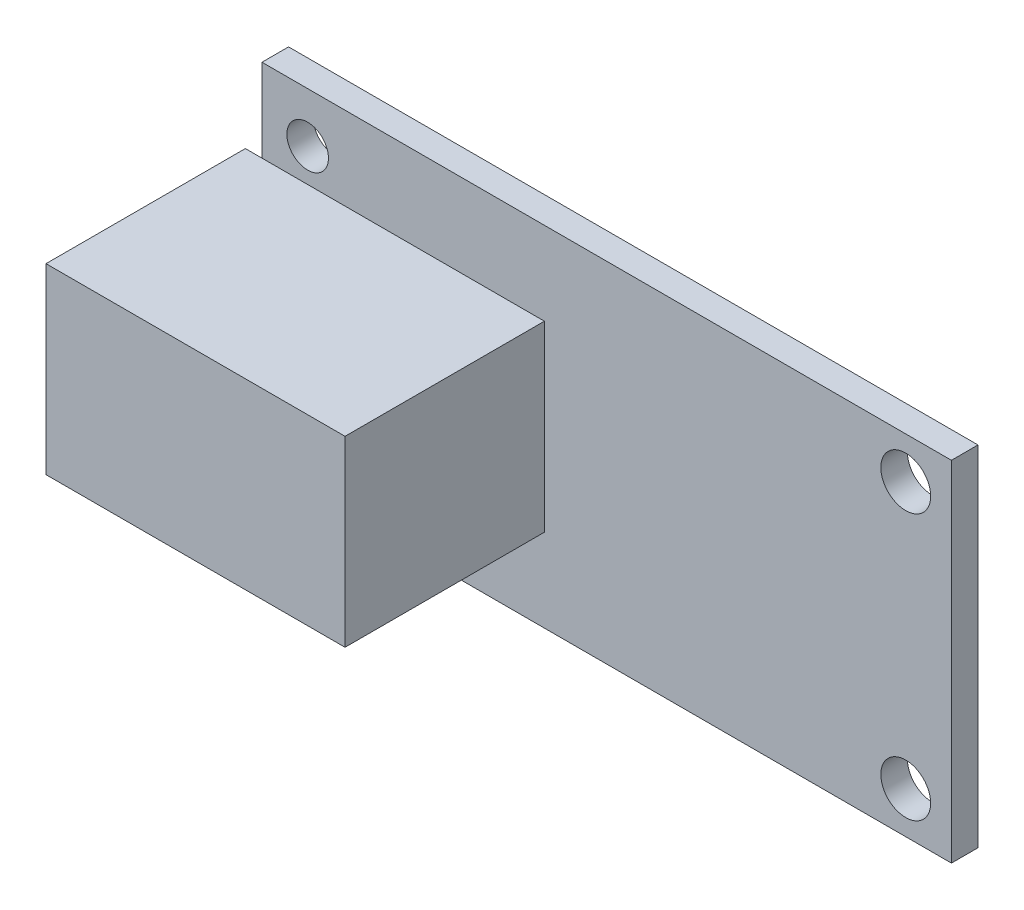
ISO-10303-21;
HEADER;
FILE_DESCRIPTION(('STEP AP214'),'2;1');
FILE_NAME('part.step','',(''),(''),'','','');
FILE_SCHEMA(('AUTOMOTIVE_DESIGN { 1 0 10303 214 1 1 1 1 }'));
ENDSEC;
DATA;
#1=APPLICATION_CONTEXT('core data for automotive mechanical design processes');
#2=APPLICATION_PROTOCOL_DEFINITION('international standard','automotive_design',2000,#1);
#3=PRODUCT_CONTEXT('',#1,'mechanical');
#4=PRODUCT('Part','Part','',(#3));
#5=PRODUCT_RELATED_PRODUCT_CATEGORY('part','',(#4));
#6=PRODUCT_DEFINITION_FORMATION('','',#4);
#7=PRODUCT_DEFINITION_CONTEXT('part definition',#1,'design');
#8=PRODUCT_DEFINITION('design','',#6,#7);
#9=PRODUCT_DEFINITION_SHAPE('','',#8);
#10=(LENGTH_UNIT() NAMED_UNIT(*) SI_UNIT(.MILLI.,.METRE.));
#11=(NAMED_UNIT(*) PLANE_ANGLE_UNIT() SI_UNIT($,.RADIAN.));
#12=(NAMED_UNIT(*) SI_UNIT($,.STERADIAN.) SOLID_ANGLE_UNIT());
#13=UNCERTAINTY_MEASURE_WITH_UNIT(LENGTH_MEASURE(1.E-05),#10,'distance_accuracy_value','');
#14=(GEOMETRIC_REPRESENTATION_CONTEXT(3) GLOBAL_UNCERTAINTY_ASSIGNED_CONTEXT((#13)) GLOBAL_UNIT_ASSIGNED_CONTEXT((#10,
#11,#12)) REPRESENTATION_CONTEXT('',''));
#15=CARTESIAN_POINT('',(0.,0.,0.));
#16=DIRECTION('',(0.,0.,1.));
#17=DIRECTION('',(1.,0.,0.));
#18=AXIS2_PLACEMENT_3D('',#15,#16,#17);
#19=CARTESIAN_POINT('',(-20.75,10.5,1.6));
#20=DIRECTION('',(1.,0.,0.));
#21=DIRECTION('',(0.,0.,-1.));
#22=AXIS2_PLACEMENT_3D('',#19,#20,#21);
#23=PLANE('',#22);
#24=DIRECTION('',(0.,-1.,0.));
#25=VECTOR('',#24,1.);
#26=CARTESIAN_POINT('',(-20.75,10.5,0.));
#27=LINE('',#26,#25);
#28=CARTESIAN_POINT('',(-20.75,10.5,0.));
#29=VERTEX_POINT('',#28);
#30=CARTESIAN_POINT('',(-20.75,-10.5,0.));
#31=VERTEX_POINT('',#30);
#32=EDGE_CURVE('E129',#29,#31,#27,.T.);
#33=ORIENTED_EDGE('',*,*,#32,.T.);
#34=DIRECTION('',(0.,0.,-1.));
#35=VECTOR('',#34,1.);
#36=CARTESIAN_POINT('',(-20.75,-10.5,1.6));
#37=LINE('',#36,#35);
#38=CARTESIAN_POINT('',(-20.75,-10.5,1.6));
#39=VERTEX_POINT('',#38);
#40=EDGE_CURVE('E37',#39,#31,#37,.T.);
#41=ORIENTED_EDGE('',*,*,#40,.F.);
#42=DIRECTION('',(0.,-1.,0.));
#43=VECTOR('',#42,1.);
#44=CARTESIAN_POINT('',(-20.75,10.5,1.6));
#45=LINE('',#44,#43);
#46=CARTESIAN_POINT('',(-20.75,-5.49999999999999,1.6));
#47=VERTEX_POINT('',#46);
#48=EDGE_CURVE('E142',#47,#39,#45,.T.);
#49=ORIENTED_EDGE('',*,*,#48,.F.);
#50=CARTESIAN_POINT('',(-20.75,5.5,1.6));
#51=VERTEX_POINT('',#50);
#52=EDGE_CURVE('E141',#51,#47,#45,.T.);
#53=ORIENTED_EDGE('',*,*,#52,.F.);
#54=CARTESIAN_POINT('',(-20.75,10.5,1.6));
#55=VERTEX_POINT('',#54);
#56=EDGE_CURVE('E138',#55,#51,#45,.T.);
#57=ORIENTED_EDGE('',*,*,#56,.F.);
#58=DIRECTION('',(0.,0.,-1.));
#59=VECTOR('',#58,1.);
#60=CARTESIAN_POINT('',(-20.75,10.5,1.6));
#61=LINE('',#60,#59);
#62=EDGE_CURVE('E147',#55,#29,#61,.T.);
#63=ORIENTED_EDGE('',*,*,#62,.T.);
#64=EDGE_LOOP('',(#33,#41,#49,#53,#57,#63));
#65=FACE_BOUND('',#64,.T.);
#66=ADVANCED_FACE('F34',(#65),#23,.F.);
#67=CARTESIAN_POINT('',(-20.75,-10.5,1.6));
#68=DIRECTION('',(0.,1.,0.));
#69=DIRECTION('',(0.,0.,1.));
#70=AXIS2_PLACEMENT_3D('',#67,#68,#69);
#71=PLANE('',#70);
#72=DIRECTION('',(1.,0.,0.));
#73=VECTOR('',#72,1.);
#74=CARTESIAN_POINT('',(-20.75,-10.5,0.));
#75=LINE('',#74,#73);
#76=CARTESIAN_POINT('',(20.75,-10.5,0.));
#77=VERTEX_POINT('',#76);
#78=EDGE_CURVE('E132',#31,#77,#75,.T.);
#79=ORIENTED_EDGE('',*,*,#78,.T.);
#80=DIRECTION('',(0.,0.,-1.));
#81=VECTOR('',#80,1.);
#82=CARTESIAN_POINT('',(20.75,-10.5,1.6));
#83=LINE('',#82,#81);
#84=CARTESIAN_POINT('',(20.75,-10.5,1.6));
#85=VERTEX_POINT('',#84);
#86=EDGE_CURVE('E158',#85,#77,#83,.T.);
#87=ORIENTED_EDGE('',*,*,#86,.F.);
#88=DIRECTION('',(1.,0.,0.));
#89=VECTOR('',#88,1.);
#90=CARTESIAN_POINT('',(-20.75,-10.5,1.6));
#91=LINE('',#90,#89);
#92=EDGE_CURVE('E140',#39,#85,#91,.T.);
#93=ORIENTED_EDGE('',*,*,#92,.F.);
#94=ORIENTED_EDGE('',*,*,#40,.T.);
#95=EDGE_LOOP('',(#79,#87,#93,#94));
#96=FACE_BOUND('',#95,.T.);
#97=ADVANCED_FACE('F168',(#96),#71,.F.);
#98=CARTESIAN_POINT('',(20.75,10.5,1.6));
#99=DIRECTION('',(-1.,0.,0.));
#100=DIRECTION('',(0.,0.,1.));
#101=AXIS2_PLACEMENT_3D('',#98,#99,#100);
#102=PLANE('',#101);
#103=DIRECTION('',(0.,1.,0.));
#104=VECTOR('',#103,1.);
#105=CARTESIAN_POINT('',(20.75,10.5,0.));
#106=LINE('',#105,#104);
#107=CARTESIAN_POINT('',(20.75,10.5,0.));
#108=VERTEX_POINT('',#107);
#109=EDGE_CURVE('E150',#77,#108,#106,.T.);
#110=ORIENTED_EDGE('',*,*,#109,.T.);
#111=DIRECTION('',(0.,0.,-1.));
#112=VECTOR('',#111,1.);
#113=CARTESIAN_POINT('',(20.75,10.5,1.6));
#114=LINE('',#113,#112);
#115=CARTESIAN_POINT('',(20.75,10.5,1.6));
#116=VERTEX_POINT('',#115);
#117=EDGE_CURVE('E156',#116,#108,#114,.T.);
#118=ORIENTED_EDGE('',*,*,#117,.F.);
#119=DIRECTION('',(0.,1.,0.));
#120=VECTOR('',#119,1.);
#121=CARTESIAN_POINT('',(20.75,10.5,1.6));
#122=LINE('',#121,#120);
#123=EDGE_CURVE('E144',#85,#116,#122,.T.);
#124=ORIENTED_EDGE('',*,*,#123,.F.);
#125=ORIENTED_EDGE('',*,*,#86,.T.);
#126=EDGE_LOOP('',(#110,#118,#124,#125));
#127=FACE_BOUND('',#126,.T.);
#128=ADVANCED_FACE('F177',(#127),#102,.F.);
#129=CARTESIAN_POINT('',(-20.75,10.5,1.6));
#130=DIRECTION('',(0.,-1.,0.));
#131=DIRECTION('',(0.,0.,-1.));
#132=AXIS2_PLACEMENT_3D('',#129,#130,#131);
#133=PLANE('',#132);
#134=DIRECTION('',(-1.,0.,0.));
#135=VECTOR('',#134,1.);
#136=CARTESIAN_POINT('',(-20.75,10.5,0.));
#137=LINE('',#136,#135);
#138=EDGE_CURVE('E152',#108,#29,#137,.T.);
#139=ORIENTED_EDGE('',*,*,#138,.T.);
#140=ORIENTED_EDGE('',*,*,#62,.F.);
#141=DIRECTION('',(-1.,0.,0.));
#142=VECTOR('',#141,1.);
#143=CARTESIAN_POINT('',(-20.75,10.5,1.6));
#144=LINE('',#143,#142);
#145=EDGE_CURVE('E146',#116,#55,#144,.T.);
#146=ORIENTED_EDGE('',*,*,#145,.F.);
#147=ORIENTED_EDGE('',*,*,#117,.T.);
#148=EDGE_LOOP('',(#139,#140,#146,#147));
#149=FACE_BOUND('',#148,.T.);
#150=ADVANCED_FACE('F180',(#149),#133,.F.);
#151=CARTESIAN_POINT('',(0.,0.,1.6));
#152=DIRECTION('',(0.,0.,1.));
#153=DIRECTION('',(1.,0.,0.));
#154=AXIS2_PLACEMENT_3D('',#151,#152,#153);
#155=PLANE('',#154);
#156=CARTESIAN_POINT('',(-18.,-7.5,1.6));
#157=DIRECTION('',(0.,0.,1.));
#158=DIRECTION('',(-1.,0.,0.));
#159=AXIS2_PLACEMENT_3D('',#156,#157,#158);
#160=CIRCLE('',#159,1.25);
#161=CARTESIAN_POINT('',(-19.25,-7.5,1.6));
#162=VERTEX_POINT('',#161);
#163=EDGE_CURVE('E209',#162,#162,#160,.T.);
#164=ORIENTED_EDGE('',*,*,#163,.F.);
#165=EDGE_LOOP('',(#164));
#166=FACE_BOUND('',#165,.T.);
#167=CARTESIAN_POINT('',(18.,-7.99999999999999,1.6));
#168=DIRECTION('',(0.,0.,1.));
#169=DIRECTION('',(-1.,0.,0.));
#170=AXIS2_PLACEMENT_3D('',#167,#168,#169);
#171=CIRCLE('',#170,1.5);
#172=CARTESIAN_POINT('',(16.5,-7.99999999999999,1.6));
#173=VERTEX_POINT('',#172);
#174=EDGE_CURVE('E215',#173,#173,#171,.T.);
#175=ORIENTED_EDGE('',*,*,#174,.F.);
#176=EDGE_LOOP('',(#175));
#177=FACE_BOUND('',#176,.T.);
#178=CARTESIAN_POINT('',(18.,8.00000000000001,1.6));
#179=DIRECTION('',(0.,0.,1.));
#180=DIRECTION('',(1.,0.,0.));
#181=AXIS2_PLACEMENT_3D('',#178,#179,#180);
#182=CIRCLE('',#181,1.5);
#183=CARTESIAN_POINT('',(19.5,8.00000000000001,1.6));
#184=VERTEX_POINT('',#183);
#185=EDGE_CURVE('E221',#184,#184,#182,.T.);
#186=ORIENTED_EDGE('',*,*,#185,.F.);
#187=EDGE_LOOP('',(#186));
#188=FACE_BOUND('',#187,.T.);
#189=CARTESIAN_POINT('',(-18.,7.5,1.6));
#190=DIRECTION('',(0.,0.,1.));
#191=DIRECTION('',(1.,0.,0.));
#192=AXIS2_PLACEMENT_3D('',#189,#190,#191);
#193=CIRCLE('',#192,1.25);
#194=CARTESIAN_POINT('',(-16.75,7.5,1.6));
#195=VERTEX_POINT('',#194);
#196=EDGE_CURVE('E203',#195,#195,#193,.T.);
#197=ORIENTED_EDGE('',*,*,#196,.F.);
#198=EDGE_LOOP('',(#197));
#199=FACE_BOUND('',#198,.T.);
#200=DIRECTION('',(-1.,0.,0.));
#201=VECTOR('',#200,1.);
#202=CARTESIAN_POINT('',(-21.75,5.5,1.6));
#203=LINE('',#202,#201);
#204=CARTESIAN_POINT('',(-3.75,5.5,1.6));
#205=VERTEX_POINT('',#204);
#206=EDGE_CURVE('E50',#205,#51,#203,.T.);
#207=ORIENTED_EDGE('',*,*,#206,.F.);
#208=DIRECTION('',(0.,1.,0.));
#209=VECTOR('',#208,1.);
#210=CARTESIAN_POINT('',(-3.75,5.5,1.6));
#211=LINE('',#210,#209);
#212=CARTESIAN_POINT('',(-3.75,-5.5,1.6));
#213=VERTEX_POINT('',#212);
#214=EDGE_CURVE('E187',#213,#205,#211,.T.);
#215=ORIENTED_EDGE('',*,*,#214,.F.);
#216=DIRECTION('',(1.,0.,0.));
#217=VECTOR('',#216,1.);
#218=CARTESIAN_POINT('',(-21.75,-5.5,1.6));
#219=LINE('',#218,#217);
#220=EDGE_CURVE('E11',#47,#213,#219,.T.);
#221=ORIENTED_EDGE('',*,*,#220,.F.);
#222=ORIENTED_EDGE('',*,*,#48,.T.);
#223=ORIENTED_EDGE('',*,*,#92,.T.);
#224=ORIENTED_EDGE('',*,*,#123,.T.);
#225=ORIENTED_EDGE('',*,*,#145,.T.);
#226=ORIENTED_EDGE('',*,*,#56,.T.);
#227=EDGE_LOOP('',(#207,#215,#221,#222,#223,#224,#225,#226));
#228=FACE_BOUND('',#227,.T.);
#229=ADVANCED_FACE('F181',(#166,#177,#188,#199,#228),#155,.T.);
#230=CARTESIAN_POINT('',(0.,0.,0.));
#231=DIRECTION('',(0.,0.,1.));
#232=DIRECTION('',(1.,0.,0.));
#233=AXIS2_PLACEMENT_3D('',#230,#231,#232);
#234=PLANE('',#233);
#235=CARTESIAN_POINT('',(-18.,-7.5,0.));
#236=DIRECTION('',(0.,0.,1.));
#237=DIRECTION('',(-1.,0.,0.));
#238=AXIS2_PLACEMENT_3D('',#235,#236,#237);
#239=CIRCLE('',#238,1.25);
#240=CARTESIAN_POINT('',(-19.25,-7.5,0.));
#241=VERTEX_POINT('',#240);
#242=EDGE_CURVE('E212',#241,#241,#239,.T.);
#243=ORIENTED_EDGE('',*,*,#242,.T.);
#244=EDGE_LOOP('',(#243));
#245=FACE_BOUND('',#244,.T.);
#246=CARTESIAN_POINT('',(18.,-7.99999999999999,0.));
#247=DIRECTION('',(0.,0.,1.));
#248=DIRECTION('',(-1.,0.,0.));
#249=AXIS2_PLACEMENT_3D('',#246,#247,#248);
#250=CIRCLE('',#249,1.5);
#251=CARTESIAN_POINT('',(16.5,-7.99999999999999,0.));
#252=VERTEX_POINT('',#251);
#253=EDGE_CURVE('E218',#252,#252,#250,.T.);
#254=ORIENTED_EDGE('',*,*,#253,.T.);
#255=EDGE_LOOP('',(#254));
#256=FACE_BOUND('',#255,.T.);
#257=CARTESIAN_POINT('',(18.,8.00000000000001,0.));
#258=DIRECTION('',(0.,0.,1.));
#259=DIRECTION('',(1.,0.,0.));
#260=AXIS2_PLACEMENT_3D('',#257,#258,#259);
#261=CIRCLE('',#260,1.5);
#262=CARTESIAN_POINT('',(19.5,8.00000000000001,0.));
#263=VERTEX_POINT('',#262);
#264=EDGE_CURVE('E206',#263,#263,#261,.T.);
#265=ORIENTED_EDGE('',*,*,#264,.T.);
#266=EDGE_LOOP('',(#265));
#267=FACE_BOUND('',#266,.T.);
#268=CARTESIAN_POINT('',(-18.,7.5,0.));
#269=DIRECTION('',(0.,0.,1.));
#270=DIRECTION('',(1.,0.,0.));
#271=AXIS2_PLACEMENT_3D('',#268,#269,#270);
#272=CIRCLE('',#271,1.25);
#273=CARTESIAN_POINT('',(-16.75,7.5,0.));
#274=VERTEX_POINT('',#273);
#275=EDGE_CURVE('E189',#274,#274,#272,.T.);
#276=ORIENTED_EDGE('',*,*,#275,.T.);
#277=EDGE_LOOP('',(#276));
#278=FACE_BOUND('',#277,.T.);
#279=ORIENTED_EDGE('',*,*,#32,.F.);
#280=ORIENTED_EDGE('',*,*,#138,.F.);
#281=ORIENTED_EDGE('',*,*,#109,.F.);
#282=ORIENTED_EDGE('',*,*,#78,.F.);
#283=EDGE_LOOP('',(#279,#280,#281,#282));
#284=FACE_BOUND('',#283,.T.);
#285=ADVANCED_FACE('F175',(#245,#256,#267,#278,#284),#234,.F.);
#286=CARTESIAN_POINT('',(0.,0.,1.6));
#287=DIRECTION('',(0.,0.,1.));
#288=DIRECTION('',(1.,0.,0.));
#289=AXIS2_PLACEMENT_3D('',#286,#287,#288);
#290=PLANE('',#289);
#291=CARTESIAN_POINT('',(-21.75,5.5,1.6));
#292=VERTEX_POINT('',#291);
#293=EDGE_CURVE('E186',#51,#292,#203,.T.);
#294=ORIENTED_EDGE('',*,*,#293,.F.);
#295=ORIENTED_EDGE('',*,*,#52,.T.);
#296=CARTESIAN_POINT('',(-21.75,-5.5,1.6));
#297=VERTEX_POINT('',#296);
#298=EDGE_CURVE('E43',#297,#47,#219,.T.);
#299=ORIENTED_EDGE('',*,*,#298,.F.);
#300=DIRECTION('',(0.,-1.,0.));
#301=VECTOR('',#300,1.);
#302=CARTESIAN_POINT('',(-21.75,5.5,1.6));
#303=LINE('',#302,#301);
#304=EDGE_CURVE('E128',#292,#297,#303,.T.);
#305=ORIENTED_EDGE('',*,*,#304,.F.);
#306=EDGE_LOOP('',(#294,#295,#299,#305));
#307=FACE_BOUND('',#306,.T.);
#308=ADVANCED_FACE('F185',(#307),#290,.F.);
#309=CARTESIAN_POINT('',(-21.75,5.5,13.6));
#310=DIRECTION('',(1.,0.,0.));
#311=DIRECTION('',(0.,0.,-1.));
#312=AXIS2_PLACEMENT_3D('',#309,#310,#311);
#313=PLANE('',#312);
#314=ORIENTED_EDGE('',*,*,#304,.T.);
#315=DIRECTION('',(0.,0.,-1.));
#316=VECTOR('',#315,1.);
#317=CARTESIAN_POINT('',(-21.75,-5.5,13.6));
#318=LINE('',#317,#316);
#319=CARTESIAN_POINT('',(-21.75,-5.5,13.6));
#320=VERTEX_POINT('',#319);
#321=EDGE_CURVE('E109',#320,#297,#318,.T.);
#322=ORIENTED_EDGE('',*,*,#321,.F.);
#323=DIRECTION('',(0.,-1.,0.));
#324=VECTOR('',#323,1.);
#325=CARTESIAN_POINT('',(-21.75,5.5,13.6));
#326=LINE('',#325,#324);
#327=CARTESIAN_POINT('',(-21.75,5.5,13.6));
#328=VERTEX_POINT('',#327);
#329=EDGE_CURVE('E116',#328,#320,#326,.T.);
#330=ORIENTED_EDGE('',*,*,#329,.F.);
#331=DIRECTION('',(0.,0.,-1.));
#332=VECTOR('',#331,1.);
#333=CARTESIAN_POINT('',(-21.75,5.5,13.6));
#334=LINE('',#333,#332);
#335=EDGE_CURVE('E194',#328,#292,#334,.T.);
#336=ORIENTED_EDGE('',*,*,#335,.T.);
#337=EDGE_LOOP('',(#314,#322,#330,#336));
#338=FACE_BOUND('',#337,.T.);
#339=ADVANCED_FACE('F126',(#338),#313,.F.);
#340=CARTESIAN_POINT('',(-21.75,-5.5,13.6));
#341=DIRECTION('',(0.,1.,0.));
#342=DIRECTION('',(0.,0.,1.));
#343=AXIS2_PLACEMENT_3D('',#340,#341,#342);
#344=PLANE('',#343);
#345=ORIENTED_EDGE('',*,*,#298,.T.);
#346=ORIENTED_EDGE('',*,*,#220,.T.);
#347=DIRECTION('',(0.,0.,-1.));
#348=VECTOR('',#347,1.);
#349=CARTESIAN_POINT('',(-3.75,-5.5,13.6));
#350=LINE('',#349,#348);
#351=CARTESIAN_POINT('',(-3.75,-5.5,13.6));
#352=VERTEX_POINT('',#351);
#353=EDGE_CURVE('E112',#352,#213,#350,.T.);
#354=ORIENTED_EDGE('',*,*,#353,.F.);
#355=DIRECTION('',(1.,0.,0.));
#356=VECTOR('',#355,1.);
#357=CARTESIAN_POINT('',(-21.75,-5.5,13.6));
#358=LINE('',#357,#356);
#359=EDGE_CURVE('E104',#320,#352,#358,.T.);
#360=ORIENTED_EDGE('',*,*,#359,.F.);
#361=ORIENTED_EDGE('',*,*,#321,.T.);
#362=EDGE_LOOP('',(#345,#346,#354,#360,#361));
#363=FACE_BOUND('',#362,.T.);
#364=ADVANCED_FACE('F107',(#363),#344,.F.);
#365=CARTESIAN_POINT('',(-3.75,5.5,13.6));
#366=DIRECTION('',(-1.,0.,0.));
#367=DIRECTION('',(0.,0.,1.));
#368=AXIS2_PLACEMENT_3D('',#365,#366,#367);
#369=PLANE('',#368);
#370=ORIENTED_EDGE('',*,*,#214,.T.);
#371=DIRECTION('',(0.,0.,-1.));
#372=VECTOR('',#371,1.);
#373=CARTESIAN_POINT('',(-3.75,5.5,13.6));
#374=LINE('',#373,#372);
#375=CARTESIAN_POINT('',(-3.75,5.5,13.6));
#376=VERTEX_POINT('',#375);
#377=EDGE_CURVE('E134',#376,#205,#374,.T.);
#378=ORIENTED_EDGE('',*,*,#377,.F.);
#379=DIRECTION('',(0.,1.,0.));
#380=VECTOR('',#379,1.);
#381=CARTESIAN_POINT('',(-3.75,5.5,13.6));
#382=LINE('',#381,#380);
#383=EDGE_CURVE('E115',#352,#376,#382,.T.);
#384=ORIENTED_EDGE('',*,*,#383,.F.);
#385=ORIENTED_EDGE('',*,*,#353,.T.);
#386=EDGE_LOOP('',(#370,#378,#384,#385));
#387=FACE_BOUND('',#386,.T.);
#388=ADVANCED_FACE('F200',(#387),#369,.F.);
#389=CARTESIAN_POINT('',(-21.75,5.5,13.6));
#390=DIRECTION('',(0.,-1.,0.));
#391=DIRECTION('',(0.,0.,-1.));
#392=AXIS2_PLACEMENT_3D('',#389,#390,#391);
#393=PLANE('',#392);
#394=ORIENTED_EDGE('',*,*,#206,.T.);
#395=ORIENTED_EDGE('',*,*,#293,.T.);
#396=ORIENTED_EDGE('',*,*,#335,.F.);
#397=DIRECTION('',(-1.,0.,0.));
#398=VECTOR('',#397,1.);
#399=CARTESIAN_POINT('',(-21.75,5.5,13.6));
#400=LINE('',#399,#398);
#401=EDGE_CURVE('E121',#376,#328,#400,.T.);
#402=ORIENTED_EDGE('',*,*,#401,.F.);
#403=ORIENTED_EDGE('',*,*,#377,.T.);
#404=EDGE_LOOP('',(#394,#395,#396,#402,#403));
#405=FACE_BOUND('',#404,.T.);
#406=ADVANCED_FACE('F198',(#405),#393,.F.);
#407=CARTESIAN_POINT('',(0.,0.,13.6));
#408=DIRECTION('',(0.,0.,1.));
#409=DIRECTION('',(1.,0.,0.));
#410=AXIS2_PLACEMENT_3D('',#407,#408,#409);
#411=PLANE('',#410);
#412=ORIENTED_EDGE('',*,*,#329,.T.);
#413=ORIENTED_EDGE('',*,*,#359,.T.);
#414=ORIENTED_EDGE('',*,*,#383,.T.);
#415=ORIENTED_EDGE('',*,*,#401,.T.);
#416=EDGE_LOOP('',(#412,#413,#414,#415));
#417=FACE_BOUND('',#416,.T.);
#418=ADVANCED_FACE('F119',(#417),#411,.T.);
#419=CARTESIAN_POINT('',(-18.,7.5,0.));
#420=DIRECTION('',(0.,0.,1.));
#421=DIRECTION('',(1.,0.,0.));
#422=AXIS2_PLACEMENT_3D('',#419,#420,#421);
#423=CYLINDRICAL_SURFACE('',#422,1.25);
#424=ORIENTED_EDGE('',*,*,#275,.F.);
#425=EDGE_LOOP('',(#424));
#426=FACE_BOUND('',#425,.T.);
#427=ORIENTED_EDGE('',*,*,#196,.T.);
#428=EDGE_LOOP('',(#427));
#429=FACE_BOUND('',#428,.T.);
#430=ADVANCED_FACE('F233',(#426,#429),#423,.F.);
#431=CARTESIAN_POINT('',(18.,8.00000000000001,0.));
#432=DIRECTION('',(0.,0.,1.));
#433=DIRECTION('',(1.,0.,0.));
#434=AXIS2_PLACEMENT_3D('',#431,#432,#433);
#435=CYLINDRICAL_SURFACE('',#434,1.5);
#436=ORIENTED_EDGE('',*,*,#264,.F.);
#437=EDGE_LOOP('',(#436));
#438=FACE_BOUND('',#437,.T.);
#439=ORIENTED_EDGE('',*,*,#185,.T.);
#440=EDGE_LOOP('',(#439));
#441=FACE_BOUND('',#440,.T.);
#442=ADVANCED_FACE('F229',(#438,#441),#435,.F.);
#443=CARTESIAN_POINT('',(18.,-7.99999999999999,0.));
#444=DIRECTION('',(0.,0.,1.));
#445=DIRECTION('',(1.,0.,0.));
#446=AXIS2_PLACEMENT_3D('',#443,#444,#445);
#447=CYLINDRICAL_SURFACE('',#446,1.5);
#448=ORIENTED_EDGE('',*,*,#253,.F.);
#449=EDGE_LOOP('',(#448));
#450=FACE_BOUND('',#449,.T.);
#451=ORIENTED_EDGE('',*,*,#174,.T.);
#452=EDGE_LOOP('',(#451));
#453=FACE_BOUND('',#452,.T.);
#454=ADVANCED_FACE('F232',(#450,#453),#447,.F.);
#455=CARTESIAN_POINT('',(-18.,-7.5,0.));
#456=DIRECTION('',(0.,0.,1.));
#457=DIRECTION('',(1.,0.,0.));
#458=AXIS2_PLACEMENT_3D('',#455,#456,#457);
#459=CYLINDRICAL_SURFACE('',#458,1.25);
#460=ORIENTED_EDGE('',*,*,#242,.F.);
#461=EDGE_LOOP('',(#460));
#462=FACE_BOUND('',#461,.T.);
#463=ORIENTED_EDGE('',*,*,#163,.T.);
#464=EDGE_LOOP('',(#463));
#465=FACE_BOUND('',#464,.T.);
#466=ADVANCED_FACE('F329',(#462,#465),#459,.F.);
#467=CLOSED_SHELL('',(#66,#97,#128,#150,#229,#285,#308,#339,#364,#388,#406,#418,#430,#442,#454,#466));
#468=MANIFOLD_SOLID_BREP('B2',#467);
#469=ADVANCED_BREP_SHAPE_REPRESENTATION('',(#18,#468),#14);
#470=SHAPE_DEFINITION_REPRESENTATION(#9,#469);
ENDSEC;
END-ISO-10303-21;
